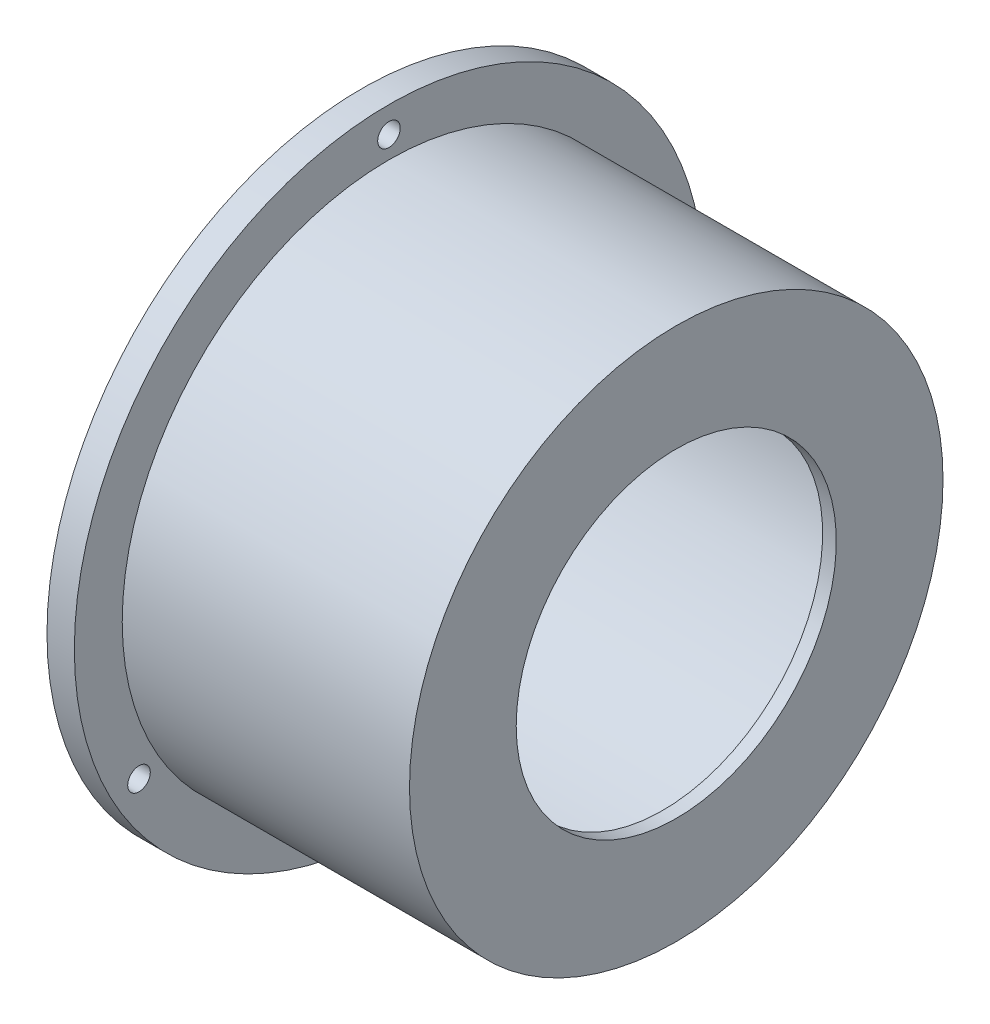
ISO-10303-21;
HEADER;
FILE_DESCRIPTION(('STEP AP214'),'2;1');
FILE_NAME('part.step','',(''),(''),'','','');
FILE_SCHEMA(('AUTOMOTIVE_DESIGN { 1 0 10303 214 1 1 1 1 }'));
ENDSEC;
DATA;
#1=APPLICATION_CONTEXT('core data for automotive mechanical design processes');
#2=APPLICATION_PROTOCOL_DEFINITION('international standard','automotive_design',2000,#1);
#3=PRODUCT_CONTEXT('',#1,'mechanical');
#4=PRODUCT('Part','Part','',(#3));
#5=PRODUCT_RELATED_PRODUCT_CATEGORY('part','',(#4));
#6=PRODUCT_DEFINITION_FORMATION('','',#4);
#7=PRODUCT_DEFINITION_CONTEXT('part definition',#1,'design');
#8=PRODUCT_DEFINITION('design','',#6,#7);
#9=PRODUCT_DEFINITION_SHAPE('','',#8);
#10=(LENGTH_UNIT() NAMED_UNIT(*) SI_UNIT(.MILLI.,.METRE.));
#11=(NAMED_UNIT(*) PLANE_ANGLE_UNIT() SI_UNIT($,.RADIAN.));
#12=(NAMED_UNIT(*) SI_UNIT($,.STERADIAN.) SOLID_ANGLE_UNIT());
#13=UNCERTAINTY_MEASURE_WITH_UNIT(LENGTH_MEASURE(1.E-05),#10,'distance_accuracy_value','');
#14=(GEOMETRIC_REPRESENTATION_CONTEXT(3) GLOBAL_UNCERTAINTY_ASSIGNED_CONTEXT((#13)) GLOBAL_UNIT_ASSIGNED_CONTEXT((#10,
#11,#12)) REPRESENTATION_CONTEXT('',''));
#15=CARTESIAN_POINT('',(0.,0.,0.));
#16=DIRECTION('',(0.,0.,1.));
#17=DIRECTION('',(1.,0.,0.));
#18=AXIS2_PLACEMENT_3D('',#15,#16,#17);
#19=CARTESIAN_POINT('',(135.7,46.,0.));
#20=DIRECTION('',(1.,0.,0.));
#21=DIRECTION('',(0.,0.,-1.));
#22=AXIS2_PLACEMENT_3D('',#19,#20,#21);
#23=PLANE('',#22);
#24=CARTESIAN_POINT('',(135.7,42.2,0.));
#25=DIRECTION('',(1.,0.,0.));
#26=DIRECTION('',(0.,0.,-1.));
#27=AXIS2_PLACEMENT_3D('',#24,#25,#26);
#28=CIRCLE('',#27,1.65);
#29=CARTESIAN_POINT('',(135.7,42.2,1.65));
#30=VERTEX_POINT('',#29);
#31=EDGE_CURVE('E62',#30,#30,#28,.F.);
#32=ORIENTED_EDGE('',*,*,#31,.F.);
#33=EDGE_LOOP('',(#32));
#34=FACE_BOUND('',#33,.T.);
#35=CARTESIAN_POINT('',(135.7,-21.1,36.5462720397033));
#36=DIRECTION('',(1.,0.,0.));
#37=DIRECTION('',(0.,0.,-1.));
#38=AXIS2_PLACEMENT_3D('',#35,#36,#37);
#39=CIRCLE('',#38,1.65);
#40=CARTESIAN_POINT('',(135.7,-21.1,38.1962720397033));
#41=VERTEX_POINT('',#40);
#42=EDGE_CURVE('E52',#41,#41,#39,.F.);
#43=ORIENTED_EDGE('',*,*,#42,.F.);
#44=EDGE_LOOP('',(#43));
#45=FACE_BOUND('',#44,.T.);
#46=CARTESIAN_POINT('',(135.7,-21.1,-36.5462720397033));
#47=DIRECTION('',(1.,0.,0.));
#48=DIRECTION('',(0.,0.,-1.));
#49=AXIS2_PLACEMENT_3D('',#46,#47,#48);
#50=CIRCLE('',#49,1.65);
#51=CARTESIAN_POINT('',(135.7,-21.1,-34.8962720397033));
#52=VERTEX_POINT('',#51);
#53=EDGE_CURVE('E49',#52,#52,#50,.F.);
#54=ORIENTED_EDGE('',*,*,#53,.F.);
#55=EDGE_LOOP('',(#54));
#56=FACE_BOUND('',#55,.T.);
#57=CARTESIAN_POINT('',(135.7,0.,0.));
#58=DIRECTION('',(-1.,0.,0.));
#59=DIRECTION('',(0.,0.,1.));
#60=AXIS2_PLACEMENT_3D('',#57,#58,#59);
#61=CIRCLE('',#60,36.4);
#62=CARTESIAN_POINT('',(135.7,0.,36.4));
#63=VERTEX_POINT('',#62);
#64=EDGE_CURVE('E10',#63,#63,#61,.T.);
#65=ORIENTED_EDGE('',*,*,#64,.F.);
#66=EDGE_LOOP('',(#65));
#67=FACE_BOUND('',#66,.T.);
#68=CARTESIAN_POINT('',(135.7,0.,0.));
#69=DIRECTION('',(-1.,0.,0.));
#70=DIRECTION('',(0.,0.,1.));
#71=AXIS2_PLACEMENT_3D('',#68,#69,#70);
#72=CIRCLE('',#71,46.);
#73=CARTESIAN_POINT('',(135.7,0.,46.));
#74=VERTEX_POINT('',#73);
#75=EDGE_CURVE('E65',#74,#74,#72,.T.);
#76=ORIENTED_EDGE('',*,*,#75,.T.);
#77=EDGE_LOOP('',(#76));
#78=FACE_BOUND('',#77,.T.);
#79=ADVANCED_FACE('F31',(#34,#45,#56,#67,#78),#23,.F.);
#80=CARTESIAN_POINT('',(-110.,0.,0.));
#81=DIRECTION('',(-1.,0.,0.));
#82=DIRECTION('',(0.,0.,1.));
#83=AXIS2_PLACEMENT_3D('',#80,#81,#82);
#84=CYLINDRICAL_SURFACE('',#83,36.4);
#85=CARTESIAN_POINT('',(179.7,0.,0.));
#86=DIRECTION('',(-1.,0.,0.));
#87=DIRECTION('',(0.,0.,1.));
#88=AXIS2_PLACEMENT_3D('',#85,#86,#87);
#89=CIRCLE('',#88,36.4);
#90=CARTESIAN_POINT('',(179.7,0.,36.4));
#91=VERTEX_POINT('',#90);
#92=EDGE_CURVE('E38',#91,#91,#89,.T.);
#93=ORIENTED_EDGE('',*,*,#92,.F.);
#94=EDGE_LOOP('',(#93));
#95=FACE_BOUND('',#94,.T.);
#96=ORIENTED_EDGE('',*,*,#64,.T.);
#97=EDGE_LOOP('',(#96));
#98=FACE_BOUND('',#97,.T.);
#99=ADVANCED_FACE('F87',(#95,#98),#84,.F.);
#100=CARTESIAN_POINT('',(179.7,36.4,0.));
#101=DIRECTION('',(1.,0.,0.));
#102=DIRECTION('',(0.,0.,-1.));
#103=AXIS2_PLACEMENT_3D('',#100,#101,#102);
#104=PLANE('',#103);
#105=CARTESIAN_POINT('',(179.7,0.,0.));
#106=DIRECTION('',(-1.,0.,0.));
#107=DIRECTION('',(0.,0.,1.));
#108=AXIS2_PLACEMENT_3D('',#105,#106,#107);
#109=CIRCLE('',#108,23.4);
#110=CARTESIAN_POINT('',(179.7,0.,23.4));
#111=VERTEX_POINT('',#110);
#112=EDGE_CURVE('E43',#111,#111,#109,.T.);
#113=ORIENTED_EDGE('',*,*,#112,.F.);
#114=EDGE_LOOP('',(#113));
#115=FACE_BOUND('',#114,.T.);
#116=ORIENTED_EDGE('',*,*,#92,.T.);
#117=EDGE_LOOP('',(#116));
#118=FACE_BOUND('',#117,.T.);
#119=ADVANCED_FACE('F84',(#115,#118),#104,.F.);
#120=CARTESIAN_POINT('',(-110.,0.,0.));
#121=DIRECTION('',(-1.,0.,0.));
#122=DIRECTION('',(0.,0.,1.));
#123=AXIS2_PLACEMENT_3D('',#120,#121,#122);
#124=CYLINDRICAL_SURFACE('',#123,23.4);
#125=CARTESIAN_POINT('',(181.7,0.,0.));
#126=DIRECTION('',(-1.,0.,0.));
#127=DIRECTION('',(0.,0.,1.));
#128=AXIS2_PLACEMENT_3D('',#125,#126,#127);
#129=CIRCLE('',#128,23.4);
#130=CARTESIAN_POINT('',(181.7,0.,23.4));
#131=VERTEX_POINT('',#130);
#132=EDGE_CURVE('E77',#131,#131,#129,.T.);
#133=ORIENTED_EDGE('',*,*,#132,.F.);
#134=EDGE_LOOP('',(#133));
#135=FACE_BOUND('',#134,.T.);
#136=ORIENTED_EDGE('',*,*,#112,.T.);
#137=EDGE_LOOP('',(#136));
#138=FACE_BOUND('',#137,.T.);
#139=ADVANCED_FACE('F82',(#135,#138),#124,.F.);
#140=CARTESIAN_POINT('',(181.7,23.4,0.));
#141=DIRECTION('',(-1.,0.,0.));
#142=DIRECTION('',(0.,0.,1.));
#143=AXIS2_PLACEMENT_3D('',#140,#141,#142);
#144=PLANE('',#143);
#145=CARTESIAN_POINT('',(181.7,0.,0.));
#146=DIRECTION('',(-1.,0.,0.));
#147=DIRECTION('',(0.,0.,1.));
#148=AXIS2_PLACEMENT_3D('',#145,#146,#147);
#149=CIRCLE('',#148,39.);
#150=CARTESIAN_POINT('',(181.7,0.,39.));
#151=VERTEX_POINT('',#150);
#152=EDGE_CURVE('E74',#151,#151,#149,.T.);
#153=ORIENTED_EDGE('',*,*,#152,.F.);
#154=EDGE_LOOP('',(#153));
#155=FACE_BOUND('',#154,.T.);
#156=ORIENTED_EDGE('',*,*,#132,.T.);
#157=EDGE_LOOP('',(#156));
#158=FACE_BOUND('',#157,.T.);
#159=ADVANCED_FACE('F99',(#155,#158),#144,.F.);
#160=CARTESIAN_POINT('',(-110.,0.,0.));
#161=DIRECTION('',(-1.,0.,0.));
#162=DIRECTION('',(0.,0.,1.));
#163=AXIS2_PLACEMENT_3D('',#160,#161,#162);
#164=CYLINDRICAL_SURFACE('',#163,39.);
#165=CARTESIAN_POINT('',(139.7,0.,0.));
#166=DIRECTION('',(-1.,0.,0.));
#167=DIRECTION('',(0.,0.,1.));
#168=AXIS2_PLACEMENT_3D('',#165,#166,#167);
#169=CIRCLE('',#168,39.);
#170=CARTESIAN_POINT('',(139.7,0.,39.));
#171=VERTEX_POINT('',#170);
#172=EDGE_CURVE('E71',#171,#171,#169,.T.);
#173=ORIENTED_EDGE('',*,*,#172,.F.);
#174=EDGE_LOOP('',(#173));
#175=FACE_BOUND('',#174,.T.);
#176=ORIENTED_EDGE('',*,*,#152,.T.);
#177=EDGE_LOOP('',(#176));
#178=FACE_BOUND('',#177,.T.);
#179=ADVANCED_FACE('F103',(#175,#178),#164,.T.);
#180=CARTESIAN_POINT('',(139.7,39.,0.));
#181=DIRECTION('',(-1.,0.,0.));
#182=DIRECTION('',(0.,0.,1.));
#183=AXIS2_PLACEMENT_3D('',#180,#181,#182);
#184=PLANE('',#183);
#185=CARTESIAN_POINT('',(139.7,42.2,0.));
#186=DIRECTION('',(-1.,0.,0.));
#187=DIRECTION('',(0.,0.,1.));
#188=AXIS2_PLACEMENT_3D('',#185,#186,#187);
#189=CIRCLE('',#188,1.65);
#190=CARTESIAN_POINT('',(139.7,42.2,1.65));
#191=VERTEX_POINT('',#190);
#192=EDGE_CURVE('E34',#191,#191,#189,.F.);
#193=ORIENTED_EDGE('',*,*,#192,.F.);
#194=EDGE_LOOP('',(#193));
#195=FACE_BOUND('',#194,.T.);
#196=CARTESIAN_POINT('',(139.7,-21.1,36.5462720397033));
#197=DIRECTION('',(-1.,0.,0.));
#198=DIRECTION('',(0.,0.,1.));
#199=AXIS2_PLACEMENT_3D('',#196,#197,#198);
#200=CIRCLE('',#199,1.65);
#201=CARTESIAN_POINT('',(139.7,-21.1,38.1962720397033));
#202=VERTEX_POINT('',#201);
#203=EDGE_CURVE('E50',#202,#202,#200,.F.);
#204=ORIENTED_EDGE('',*,*,#203,.F.);
#205=EDGE_LOOP('',(#204));
#206=FACE_BOUND('',#205,.T.);
#207=CARTESIAN_POINT('',(139.7,-21.1,-36.5462720397033));
#208=DIRECTION('',(-1.,0.,0.));
#209=DIRECTION('',(0.,0.,1.));
#210=AXIS2_PLACEMENT_3D('',#207,#208,#209);
#211=CIRCLE('',#210,1.65);
#212=CARTESIAN_POINT('',(139.7,-21.1,-34.8962720397033));
#213=VERTEX_POINT('',#212);
#214=EDGE_CURVE('E47',#213,#213,#211,.F.);
#215=ORIENTED_EDGE('',*,*,#214,.F.);
#216=EDGE_LOOP('',(#215));
#217=FACE_BOUND('',#216,.T.);
#218=CARTESIAN_POINT('',(139.7,0.,0.));
#219=DIRECTION('',(-1.,0.,0.));
#220=DIRECTION('',(0.,0.,1.));
#221=AXIS2_PLACEMENT_3D('',#218,#219,#220);
#222=CIRCLE('',#221,46.);
#223=CARTESIAN_POINT('',(139.7,0.,46.));
#224=VERTEX_POINT('',#223);
#225=EDGE_CURVE('E68',#224,#224,#222,.T.);
#226=ORIENTED_EDGE('',*,*,#225,.F.);
#227=EDGE_LOOP('',(#226));
#228=FACE_BOUND('',#227,.T.);
#229=ORIENTED_EDGE('',*,*,#172,.T.);
#230=EDGE_LOOP('',(#229));
#231=FACE_BOUND('',#230,.T.);
#232=ADVANCED_FACE('F107',(#195,#206,#217,#228,#231),#184,.F.);
#233=CARTESIAN_POINT('',(-110.,0.,0.));
#234=DIRECTION('',(-1.,0.,0.));
#235=DIRECTION('',(0.,0.,1.));
#236=AXIS2_PLACEMENT_3D('',#233,#234,#235);
#237=CYLINDRICAL_SURFACE('',#236,46.);
#238=ORIENTED_EDGE('',*,*,#75,.F.);
#239=EDGE_LOOP('',(#238));
#240=FACE_BOUND('',#239,.T.);
#241=ORIENTED_EDGE('',*,*,#225,.T.);
#242=EDGE_LOOP('',(#241));
#243=FACE_BOUND('',#242,.T.);
#244=ADVANCED_FACE('F111',(#240,#243),#237,.T.);
#245=CARTESIAN_POINT('',(181.7,-21.1,-36.5462720397033));
#246=DIRECTION('',(-1.,0.,0.));
#247=DIRECTION('',(0.,0.,1.));
#248=AXIS2_PLACEMENT_3D('',#245,#246,#247);
#249=CYLINDRICAL_SURFACE('',#248,1.65);
#250=CARTESIAN_POINT('',(139.7,-21.1,-34.8962720397033));
#251=CARTESIAN_POINT('',(139.658333333333,-21.1,-34.8962720397033));
#252=CARTESIAN_POINT('',(139.616666666667,-21.1,-34.8962720397033));
#253=CARTESIAN_POINT('',(139.533333333333,-21.1,-34.8962720397033));
#254=CARTESIAN_POINT('',(139.491666666667,-21.1,-34.8962720397033));
#255=CARTESIAN_POINT('',(139.408333333333,-21.1,-34.8962720397033));
#256=CARTESIAN_POINT('',(139.366666666667,-21.1,-34.8962720397033));
#257=CARTESIAN_POINT('',(139.283333333333,-21.1,-34.8962720397033));
#258=CARTESIAN_POINT('',(139.241666666667,-21.1,-34.8962720397033));
#259=CARTESIAN_POINT('',(139.158333333333,-21.1,-34.8962720397033));
#260=CARTESIAN_POINT('',(139.116666666667,-21.1,-34.8962720397033));
#261=CARTESIAN_POINT('',(139.033333333333,-21.1,-34.8962720397033));
#262=CARTESIAN_POINT('',(138.991666666667,-21.1,-34.8962720397033));
#263=CARTESIAN_POINT('',(138.908333333333,-21.1,-34.8962720397033));
#264=CARTESIAN_POINT('',(138.866666666667,-21.1,-34.8962720397033));
#265=CARTESIAN_POINT('',(138.783333333333,-21.1,-34.8962720397033));
#266=CARTESIAN_POINT('',(138.741666666667,-21.1,-34.8962720397033));
#267=CARTESIAN_POINT('',(138.658333333333,-21.1,-34.8962720397033));
#268=CARTESIAN_POINT('',(138.616666666667,-21.1,-34.8962720397033));
#269=CARTESIAN_POINT('',(138.533333333333,-21.1,-34.8962720397033));
#270=CARTESIAN_POINT('',(138.491666666667,-21.1,-34.8962720397033));
#271=CARTESIAN_POINT('',(138.408333333333,-21.1,-34.8962720397033));
#272=CARTESIAN_POINT('',(138.366666666667,-21.1,-34.8962720397033));
#273=CARTESIAN_POINT('',(138.283333333333,-21.1,-34.8962720397033));
#274=CARTESIAN_POINT('',(138.241666666667,-21.1,-34.8962720397033));
#275=CARTESIAN_POINT('',(138.158333333333,-21.1,-34.8962720397033));
#276=CARTESIAN_POINT('',(138.116666666667,-21.1,-34.8962720397033));
#277=CARTESIAN_POINT('',(138.033333333333,-21.1,-34.8962720397033));
#278=CARTESIAN_POINT('',(137.991666666667,-21.1,-34.8962720397033));
#279=CARTESIAN_POINT('',(137.908333333333,-21.1,-34.8962720397033));
#280=CARTESIAN_POINT('',(137.866666666667,-21.1,-34.8962720397033));
#281=CARTESIAN_POINT('',(137.783333333333,-21.1,-34.8962720397033));
#282=CARTESIAN_POINT('',(137.741666666667,-21.1,-34.8962720397033));
#283=CARTESIAN_POINT('',(137.658333333333,-21.1,-34.8962720397033));
#284=CARTESIAN_POINT('',(137.616666666667,-21.1,-34.8962720397033));
#285=CARTESIAN_POINT('',(137.533333333333,-21.1,-34.8962720397033));
#286=CARTESIAN_POINT('',(137.491666666667,-21.1,-34.8962720397033));
#287=CARTESIAN_POINT('',(137.408333333333,-21.1,-34.8962720397033));
#288=CARTESIAN_POINT('',(137.366666666667,-21.1,-34.8962720397033));
#289=CARTESIAN_POINT('',(137.283333333333,-21.1,-34.8962720397033));
#290=CARTESIAN_POINT('',(137.241666666667,-21.1,-34.8962720397033));
#291=CARTESIAN_POINT('',(137.158333333333,-21.1,-34.8962720397033));
#292=CARTESIAN_POINT('',(137.116666666667,-21.1,-34.8962720397033));
#293=CARTESIAN_POINT('',(137.033333333333,-21.1,-34.8962720397033));
#294=CARTESIAN_POINT('',(136.991666666667,-21.1,-34.8962720397033));
#295=CARTESIAN_POINT('',(136.908333333333,-21.1,-34.8962720397033));
#296=CARTESIAN_POINT('',(136.866666666667,-21.1,-34.8962720397033));
#297=CARTESIAN_POINT('',(136.783333333333,-21.1,-34.8962720397033));
#298=CARTESIAN_POINT('',(136.741666666667,-21.1,-34.8962720397033));
#299=CARTESIAN_POINT('',(136.658333333333,-21.1,-34.8962720397033));
#300=CARTESIAN_POINT('',(136.616666666667,-21.1,-34.8962720397033));
#301=CARTESIAN_POINT('',(136.533333333333,-21.1,-34.8962720397033));
#302=CARTESIAN_POINT('',(136.491666666667,-21.1,-34.8962720397033));
#303=CARTESIAN_POINT('',(136.408333333333,-21.1,-34.8962720397033));
#304=CARTESIAN_POINT('',(136.366666666667,-21.1,-34.8962720397033));
#305=CARTESIAN_POINT('',(136.283333333333,-21.1,-34.8962720397033));
#306=CARTESIAN_POINT('',(136.241666666667,-21.1,-34.8962720397033));
#307=CARTESIAN_POINT('',(136.158333333333,-21.1,-34.8962720397033));
#308=CARTESIAN_POINT('',(136.116666666667,-21.1,-34.8962720397033));
#309=CARTESIAN_POINT('',(136.033333333333,-21.1,-34.8962720397033));
#310=CARTESIAN_POINT('',(135.991666666667,-21.1,-34.8962720397033));
#311=CARTESIAN_POINT('',(135.908333333333,-21.1,-34.8962720397033));
#312=CARTESIAN_POINT('',(135.866666666667,-21.1,-34.8962720397033));
#313=CARTESIAN_POINT('',(135.783333333333,-21.1,-34.8962720397033));
#314=CARTESIAN_POINT('',(135.741666666667,-21.1,-34.8962720397033));
#315=CARTESIAN_POINT('',(135.7,-21.1,-34.8962720397033));
#316=B_SPLINE_CURVE_WITH_KNOTS('',3,(#250,#251,#252,#253,#254,#255,#256,#257,#258,#259,#260,
#261,#262,#263,#264,#265,#266,#267,#268,#269,#270,#271,#272,#273,#274,#275,#276,#277,#278,#279,
#280,#281,#282,#283,#284,#285,#286,#287,#288,#289,#290,#291,#292,#293,#294,#295,#296,#297,#298,
#299,#300,#301,#302,#303,#304,#305,#306,#307,#308,#309,#310,#311,#312,#313,#314,#315),
.UNSPECIFIED.,.F.,.F.,(4,2,2,2,2,2,2,2,2,2,2,2,2,2,2,2,2,2,2,2,2,2,2,2,2,2,2,2,2,2,2,2,4),(0.,
0.125000000000014,0.25,0.375000000000014,0.500000000000028,0.625000000000014,0.750000000000001,
0.875000000000015,1.00000000000003,1.12500000000001,1.25000000000003,1.37500000000002,
1.50000000000003,1.62500000000002,1.75000000000003,1.87500000000004,2.00000000000003,
2.12500000000002,2.25000000000003,2.37500000000004,2.50000000000003,2.62500000000004,
2.75000000000003,2.87500000000004,3.00000000000003,3.12500000000004,3.25000000000006,
3.37500000000004,3.50000000000003,3.62500000000004,3.75000000000006,3.87500000000005,
4.00000000000006),.UNSPECIFIED.);
#317=EDGE_CURVE('BSEAM115',#213,#52,#316,.T.);
#318=ORIENTED_EDGE('',*,*,#214,.T.);
#319=ORIENTED_EDGE('',*,*,#53,.T.);
#320=ORIENTED_EDGE('',*,*,#317,.T.);
#321=ORIENTED_EDGE('',*,*,#317,.F.);
#322=EDGE_LOOP('',(#318,#320,#319,#321));
#323=FACE_BOUND('',#322,.T.);
#324=ADVANCED_FACE('F115',(#323),#249,.F.);
#325=CARTESIAN_POINT('',(181.7,-21.1,36.5462720397033));
#326=DIRECTION('',(-1.,0.,0.));
#327=DIRECTION('',(0.,0.,1.));
#328=AXIS2_PLACEMENT_3D('',#325,#326,#327);
#329=CYLINDRICAL_SURFACE('',#328,1.65);
#330=CARTESIAN_POINT('',(139.7,-21.1,38.1962720397033));
#331=CARTESIAN_POINT('',(139.658333333333,-21.1,38.1962720397033));
#332=CARTESIAN_POINT('',(139.616666666667,-21.1,38.1962720397033));
#333=CARTESIAN_POINT('',(139.533333333333,-21.1,38.1962720397033));
#334=CARTESIAN_POINT('',(139.491666666667,-21.1,38.1962720397033));
#335=CARTESIAN_POINT('',(139.408333333333,-21.1,38.1962720397033));
#336=CARTESIAN_POINT('',(139.366666666667,-21.1,38.1962720397033));
#337=CARTESIAN_POINT('',(139.283333333333,-21.1,38.1962720397033));
#338=CARTESIAN_POINT('',(139.241666666667,-21.1,38.1962720397033));
#339=CARTESIAN_POINT('',(139.158333333333,-21.1,38.1962720397033));
#340=CARTESIAN_POINT('',(139.116666666667,-21.1,38.1962720397033));
#341=CARTESIAN_POINT('',(139.033333333333,-21.1,38.1962720397033));
#342=CARTESIAN_POINT('',(138.991666666667,-21.1,38.1962720397033));
#343=CARTESIAN_POINT('',(138.908333333333,-21.1,38.1962720397033));
#344=CARTESIAN_POINT('',(138.866666666667,-21.1,38.1962720397033));
#345=CARTESIAN_POINT('',(138.783333333333,-21.1,38.1962720397033));
#346=CARTESIAN_POINT('',(138.741666666667,-21.1,38.1962720397033));
#347=CARTESIAN_POINT('',(138.658333333333,-21.1,38.1962720397033));
#348=CARTESIAN_POINT('',(138.616666666667,-21.1,38.1962720397033));
#349=CARTESIAN_POINT('',(138.533333333333,-21.1,38.1962720397033));
#350=CARTESIAN_POINT('',(138.491666666667,-21.1,38.1962720397033));
#351=CARTESIAN_POINT('',(138.408333333333,-21.1,38.1962720397033));
#352=CARTESIAN_POINT('',(138.366666666667,-21.1,38.1962720397033));
#353=CARTESIAN_POINT('',(138.283333333333,-21.1,38.1962720397033));
#354=CARTESIAN_POINT('',(138.241666666667,-21.1,38.1962720397033));
#355=CARTESIAN_POINT('',(138.158333333333,-21.1,38.1962720397033));
#356=CARTESIAN_POINT('',(138.116666666667,-21.1,38.1962720397033));
#357=CARTESIAN_POINT('',(138.033333333333,-21.1,38.1962720397033));
#358=CARTESIAN_POINT('',(137.991666666667,-21.1,38.1962720397033));
#359=CARTESIAN_POINT('',(137.908333333333,-21.1,38.1962720397033));
#360=CARTESIAN_POINT('',(137.866666666667,-21.1,38.1962720397033));
#361=CARTESIAN_POINT('',(137.783333333333,-21.1,38.1962720397033));
#362=CARTESIAN_POINT('',(137.741666666667,-21.1,38.1962720397033));
#363=CARTESIAN_POINT('',(137.658333333333,-21.1,38.1962720397033));
#364=CARTESIAN_POINT('',(137.616666666667,-21.1,38.1962720397033));
#365=CARTESIAN_POINT('',(137.533333333333,-21.1,38.1962720397033));
#366=CARTESIAN_POINT('',(137.491666666667,-21.1,38.1962720397033));
#367=CARTESIAN_POINT('',(137.408333333333,-21.1,38.1962720397033));
#368=CARTESIAN_POINT('',(137.366666666667,-21.1,38.1962720397033));
#369=CARTESIAN_POINT('',(137.283333333333,-21.1,38.1962720397033));
#370=CARTESIAN_POINT('',(137.241666666667,-21.1,38.1962720397033));
#371=CARTESIAN_POINT('',(137.158333333333,-21.1,38.1962720397033));
#372=CARTESIAN_POINT('',(137.116666666667,-21.1,38.1962720397033));
#373=CARTESIAN_POINT('',(137.033333333333,-21.1,38.1962720397033));
#374=CARTESIAN_POINT('',(136.991666666667,-21.1,38.1962720397033));
#375=CARTESIAN_POINT('',(136.908333333333,-21.1,38.1962720397033));
#376=CARTESIAN_POINT('',(136.866666666667,-21.1,38.1962720397033));
#377=CARTESIAN_POINT('',(136.783333333333,-21.1,38.1962720397033));
#378=CARTESIAN_POINT('',(136.741666666667,-21.1,38.1962720397033));
#379=CARTESIAN_POINT('',(136.658333333333,-21.1,38.1962720397033));
#380=CARTESIAN_POINT('',(136.616666666667,-21.1,38.1962720397033));
#381=CARTESIAN_POINT('',(136.533333333333,-21.1,38.1962720397033));
#382=CARTESIAN_POINT('',(136.491666666667,-21.1,38.1962720397033));
#383=CARTESIAN_POINT('',(136.408333333333,-21.1,38.1962720397033));
#384=CARTESIAN_POINT('',(136.366666666667,-21.1,38.1962720397033));
#385=CARTESIAN_POINT('',(136.283333333333,-21.1,38.1962720397033));
#386=CARTESIAN_POINT('',(136.241666666667,-21.1,38.1962720397033));
#387=CARTESIAN_POINT('',(136.158333333333,-21.1,38.1962720397033));
#388=CARTESIAN_POINT('',(136.116666666667,-21.1,38.1962720397033));
#389=CARTESIAN_POINT('',(136.033333333333,-21.1,38.1962720397033));
#390=CARTESIAN_POINT('',(135.991666666667,-21.1,38.1962720397033));
#391=CARTESIAN_POINT('',(135.908333333333,-21.1,38.1962720397033));
#392=CARTESIAN_POINT('',(135.866666666667,-21.1,38.1962720397033));
#393=CARTESIAN_POINT('',(135.783333333333,-21.1,38.1962720397033));
#394=CARTESIAN_POINT('',(135.741666666667,-21.1,38.1962720397033));
#395=CARTESIAN_POINT('',(135.7,-21.1,38.1962720397033));
#396=B_SPLINE_CURVE_WITH_KNOTS('',3,(#330,#331,#332,#333,#334,#335,#336,#337,#338,#339,#340,
#341,#342,#343,#344,#345,#346,#347,#348,#349,#350,#351,#352,#353,#354,#355,#356,#357,#358,#359,
#360,#361,#362,#363,#364,#365,#366,#367,#368,#369,#370,#371,#372,#373,#374,#375,#376,#377,#378,
#379,#380,#381,#382,#383,#384,#385,#386,#387,#388,#389,#390,#391,#392,#393,#394,#395),
.UNSPECIFIED.,.F.,.F.,(4,2,2,2,2,2,2,2,2,2,2,2,2,2,2,2,2,2,2,2,2,2,2,2,2,2,2,2,2,2,2,2,4),(0.,
0.125000000000014,0.25,0.375000000000014,0.500000000000028,0.625000000000014,0.750000000000001,
0.875000000000015,1.00000000000003,1.12500000000001,1.25000000000003,1.37500000000002,
1.50000000000003,1.62500000000002,1.75000000000003,1.87500000000004,2.00000000000003,
2.12500000000002,2.25000000000003,2.37500000000004,2.50000000000003,2.62500000000004,
2.75000000000003,2.87500000000004,3.00000000000003,3.12500000000004,3.25000000000006,
3.37500000000004,3.50000000000003,3.62500000000004,3.75000000000006,3.87500000000005,
4.00000000000006),.UNSPECIFIED.);
#397=EDGE_CURVE('BSEAM119',#202,#41,#396,.T.);
#398=ORIENTED_EDGE('',*,*,#203,.T.);
#399=ORIENTED_EDGE('',*,*,#42,.T.);
#400=ORIENTED_EDGE('',*,*,#397,.T.);
#401=ORIENTED_EDGE('',*,*,#397,.F.);
#402=EDGE_LOOP('',(#398,#400,#399,#401));
#403=FACE_BOUND('',#402,.T.);
#404=ADVANCED_FACE('F119',(#403),#329,.F.);
#405=CARTESIAN_POINT('',(181.7,42.2,0.));
#406=DIRECTION('',(-1.,0.,0.));
#407=DIRECTION('',(0.,0.,1.));
#408=AXIS2_PLACEMENT_3D('',#405,#406,#407);
#409=CYLINDRICAL_SURFACE('',#408,1.65);
#410=CARTESIAN_POINT('',(139.7,42.2,1.65));
#411=CARTESIAN_POINT('',(139.658333333333,42.2,1.65));
#412=CARTESIAN_POINT('',(139.616666666667,42.2,1.65));
#413=CARTESIAN_POINT('',(139.533333333333,42.2,1.65));
#414=CARTESIAN_POINT('',(139.491666666667,42.2,1.65));
#415=CARTESIAN_POINT('',(139.408333333333,42.2,1.65));
#416=CARTESIAN_POINT('',(139.366666666667,42.2,1.65));
#417=CARTESIAN_POINT('',(139.283333333333,42.2,1.65));
#418=CARTESIAN_POINT('',(139.241666666667,42.2,1.65));
#419=CARTESIAN_POINT('',(139.158333333333,42.2,1.65));
#420=CARTESIAN_POINT('',(139.116666666667,42.2,1.65));
#421=CARTESIAN_POINT('',(139.033333333333,42.2,1.65));
#422=CARTESIAN_POINT('',(138.991666666667,42.2,1.65));
#423=CARTESIAN_POINT('',(138.908333333333,42.2,1.65));
#424=CARTESIAN_POINT('',(138.866666666667,42.2,1.65));
#425=CARTESIAN_POINT('',(138.783333333333,42.2,1.65));
#426=CARTESIAN_POINT('',(138.741666666667,42.2,1.65));
#427=CARTESIAN_POINT('',(138.658333333333,42.2,1.65));
#428=CARTESIAN_POINT('',(138.616666666667,42.2,1.65));
#429=CARTESIAN_POINT('',(138.533333333333,42.2,1.65));
#430=CARTESIAN_POINT('',(138.491666666667,42.2,1.65));
#431=CARTESIAN_POINT('',(138.408333333333,42.2,1.65));
#432=CARTESIAN_POINT('',(138.366666666667,42.2,1.65));
#433=CARTESIAN_POINT('',(138.283333333333,42.2,1.65));
#434=CARTESIAN_POINT('',(138.241666666667,42.2,1.65));
#435=CARTESIAN_POINT('',(138.158333333333,42.2,1.65));
#436=CARTESIAN_POINT('',(138.116666666667,42.2,1.65));
#437=CARTESIAN_POINT('',(138.033333333333,42.2,1.65));
#438=CARTESIAN_POINT('',(137.991666666667,42.2,1.65));
#439=CARTESIAN_POINT('',(137.908333333333,42.2,1.65));
#440=CARTESIAN_POINT('',(137.866666666667,42.2,1.65));
#441=CARTESIAN_POINT('',(137.783333333333,42.2,1.65));
#442=CARTESIAN_POINT('',(137.741666666667,42.2,1.65));
#443=CARTESIAN_POINT('',(137.658333333333,42.2,1.65));
#444=CARTESIAN_POINT('',(137.616666666667,42.2,1.65));
#445=CARTESIAN_POINT('',(137.533333333333,42.2,1.65));
#446=CARTESIAN_POINT('',(137.491666666667,42.2,1.65));
#447=CARTESIAN_POINT('',(137.408333333333,42.2,1.65));
#448=CARTESIAN_POINT('',(137.366666666667,42.2,1.65));
#449=CARTESIAN_POINT('',(137.283333333333,42.2,1.65));
#450=CARTESIAN_POINT('',(137.241666666667,42.2,1.65));
#451=CARTESIAN_POINT('',(137.158333333333,42.2,1.65));
#452=CARTESIAN_POINT('',(137.116666666667,42.2,1.65));
#453=CARTESIAN_POINT('',(137.033333333333,42.2,1.65));
#454=CARTESIAN_POINT('',(136.991666666667,42.2,1.65));
#455=CARTESIAN_POINT('',(136.908333333333,42.2,1.65));
#456=CARTESIAN_POINT('',(136.866666666667,42.2,1.65));
#457=CARTESIAN_POINT('',(136.783333333333,42.2,1.65));
#458=CARTESIAN_POINT('',(136.741666666667,42.2,1.65));
#459=CARTESIAN_POINT('',(136.658333333333,42.2,1.65));
#460=CARTESIAN_POINT('',(136.616666666667,42.2,1.65));
#461=CARTESIAN_POINT('',(136.533333333333,42.2,1.65));
#462=CARTESIAN_POINT('',(136.491666666667,42.2,1.65));
#463=CARTESIAN_POINT('',(136.408333333333,42.2,1.65));
#464=CARTESIAN_POINT('',(136.366666666667,42.2,1.65));
#465=CARTESIAN_POINT('',(136.283333333333,42.2,1.65));
#466=CARTESIAN_POINT('',(136.241666666667,42.2,1.65));
#467=CARTESIAN_POINT('',(136.158333333333,42.2,1.65));
#468=CARTESIAN_POINT('',(136.116666666667,42.2,1.65));
#469=CARTESIAN_POINT('',(136.033333333333,42.2,1.65));
#470=CARTESIAN_POINT('',(135.991666666667,42.2,1.65));
#471=CARTESIAN_POINT('',(135.908333333333,42.2,1.65));
#472=CARTESIAN_POINT('',(135.866666666667,42.2,1.65));
#473=CARTESIAN_POINT('',(135.783333333333,42.2,1.65));
#474=CARTESIAN_POINT('',(135.741666666667,42.2,1.65));
#475=CARTESIAN_POINT('',(135.7,42.2,1.65));
#476=B_SPLINE_CURVE_WITH_KNOTS('',3,(#410,#411,#412,#413,#414,#415,#416,#417,#418,#419,#420,
#421,#422,#423,#424,#425,#426,#427,#428,#429,#430,#431,#432,#433,#434,#435,#436,#437,#438,#439,
#440,#441,#442,#443,#444,#445,#446,#447,#448,#449,#450,#451,#452,#453,#454,#455,#456,#457,#458,
#459,#460,#461,#462,#463,#464,#465,#466,#467,#468,#469,#470,#471,#472,#473,#474,#475),
.UNSPECIFIED.,.F.,.F.,(4,2,2,2,2,2,2,2,2,2,2,2,2,2,2,2,2,2,2,2,2,2,2,2,2,2,2,2,2,2,2,2,4),(0.,
0.125000000000014,0.25,0.375000000000014,0.500000000000028,0.625000000000014,0.750000000000001,
0.875000000000015,1.00000000000003,1.12500000000001,1.25000000000003,1.37500000000002,
1.50000000000003,1.62500000000002,1.75000000000003,1.87500000000004,2.00000000000003,
2.12500000000002,2.25000000000003,2.37500000000004,2.50000000000003,2.62500000000004,
2.75000000000003,2.87500000000004,3.00000000000003,3.12500000000004,3.25000000000006,
3.37500000000004,3.50000000000003,3.62500000000004,3.75000000000006,3.87500000000005,
4.00000000000006),.UNSPECIFIED.);
#477=EDGE_CURVE('BSEAM123',#191,#30,#476,.T.);
#478=ORIENTED_EDGE('',*,*,#192,.T.);
#479=ORIENTED_EDGE('',*,*,#31,.T.);
#480=ORIENTED_EDGE('',*,*,#477,.T.);
#481=ORIENTED_EDGE('',*,*,#477,.F.);
#482=EDGE_LOOP('',(#478,#480,#479,#481));
#483=FACE_BOUND('',#482,.T.);
#484=ADVANCED_FACE('F123',(#483),#409,.F.);
#485=CLOSED_SHELL('',(#79,#99,#119,#139,#159,#179,#232,#244,#324,#404,#484));
#486=MANIFOLD_SOLID_BREP('B2',#485);
#487=ADVANCED_BREP_SHAPE_REPRESENTATION('',(#18,#486),#14);
#488=SHAPE_DEFINITION_REPRESENTATION(#9,#487);
ENDSEC;
END-ISO-10303-21;
